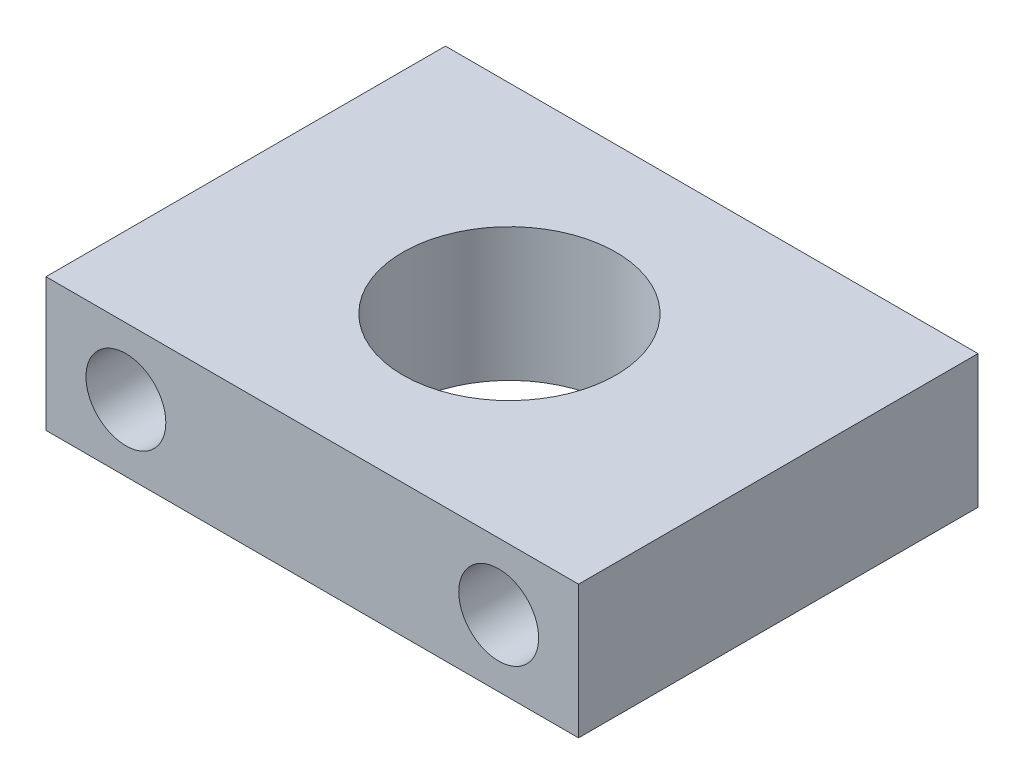
ISO-10303-21;
HEADER;
FILE_DESCRIPTION(('STEP AP214'),'2;1');
FILE_NAME('part.step','',(''),(''),'','','');
FILE_SCHEMA(('AUTOMOTIVE_DESIGN { 1 0 10303 214 1 1 1 1 }'));
ENDSEC;
DATA;
#1=APPLICATION_CONTEXT('core data for automotive mechanical design processes');
#2=APPLICATION_PROTOCOL_DEFINITION('international standard','automotive_design',2000,#1);
#3=PRODUCT_CONTEXT('',#1,'mechanical');
#4=PRODUCT('Part','Part','',(#3));
#5=PRODUCT_RELATED_PRODUCT_CATEGORY('part','',(#4));
#6=PRODUCT_DEFINITION_FORMATION('','',#4);
#7=PRODUCT_DEFINITION_CONTEXT('part definition',#1,'design');
#8=PRODUCT_DEFINITION('design','',#6,#7);
#9=PRODUCT_DEFINITION_SHAPE('','',#8);
#10=(LENGTH_UNIT() NAMED_UNIT(*) SI_UNIT(.MILLI.,.METRE.));
#11=(NAMED_UNIT(*) PLANE_ANGLE_UNIT() SI_UNIT($,.RADIAN.));
#12=(NAMED_UNIT(*) SI_UNIT($,.STERADIAN.) SOLID_ANGLE_UNIT());
#13=UNCERTAINTY_MEASURE_WITH_UNIT(LENGTH_MEASURE(1.E-05),#10,'distance_accuracy_value','');
#14=(GEOMETRIC_REPRESENTATION_CONTEXT(3) GLOBAL_UNCERTAINTY_ASSIGNED_CONTEXT((#13)) GLOBAL_UNIT_ASSIGNED_CONTEXT((#10,
#11,#12)) REPRESENTATION_CONTEXT('',''));
#15=CARTESIAN_POINT('',(0.,0.,0.));
#16=DIRECTION('',(0.,0.,1.));
#17=DIRECTION('',(1.,0.,0.));
#18=AXIS2_PLACEMENT_3D('',#15,#16,#17);
#19=CARTESIAN_POINT('',(-16.9830898985862,5.,-2.67725088495042));
#20=DIRECTION('',(1.,0.,0.));
#21=DIRECTION('',(0.,0.,-1.));
#22=AXIS2_PLACEMENT_3D('',#19,#20,#21);
#23=PLANE('',#22);
#24=DIRECTION('',(0.,0.,1.));
#25=VECTOR('',#24,1.);
#26=CARTESIAN_POINT('',(-16.9830898985862,0.,-2.67725088495042));
#27=LINE('',#26,#25);
#28=CARTESIAN_POINT('',(-16.9830898985862,0.,-2.67725088495042));
#29=VERTEX_POINT('',#28);
#30=CARTESIAN_POINT('',(-16.9830898985862,0.,12.3227491150496));
#31=VERTEX_POINT('',#30);
#32=EDGE_CURVE('E97',#29,#31,#27,.T.);
#33=ORIENTED_EDGE('',*,*,#32,.T.);
#34=DIRECTION('',(0.,-1.,0.));
#35=VECTOR('',#34,1.);
#36=CARTESIAN_POINT('',(-16.9830898985862,5.,12.3227491150496));
#37=LINE('',#36,#35);
#38=CARTESIAN_POINT('',(-16.9830898985862,5.,12.3227491150496));
#39=VERTEX_POINT('',#38);
#40=EDGE_CURVE('E11',#39,#31,#37,.T.);
#41=ORIENTED_EDGE('',*,*,#40,.F.);
#42=DIRECTION('',(0.,0.,1.));
#43=VECTOR('',#42,1.);
#44=CARTESIAN_POINT('',(-16.9830898985862,5.,-2.67725088495042));
#45=LINE('',#44,#43);
#46=CARTESIAN_POINT('',(-16.9830898985862,5.,-2.67725088495042));
#47=VERTEX_POINT('',#46);
#48=EDGE_CURVE('E85',#47,#39,#45,.T.);
#49=ORIENTED_EDGE('',*,*,#48,.F.);
#50=DIRECTION('',(0.,-1.,0.));
#51=VECTOR('',#50,1.);
#52=CARTESIAN_POINT('',(-16.9830898985862,5.,-2.67725088495042));
#53=LINE('',#52,#51);
#54=EDGE_CURVE('E93',#47,#29,#53,.T.);
#55=ORIENTED_EDGE('',*,*,#54,.T.);
#56=EDGE_LOOP('',(#33,#41,#49,#55));
#57=FACE_BOUND('',#56,.T.);
#58=ADVANCED_FACE('F34',(#57),#23,.F.);
#59=CARTESIAN_POINT('',(-16.9830898985862,5.,12.3227491150496));
#60=DIRECTION('',(0.,0.,-1.));
#61=DIRECTION('',(-1.,0.,0.));
#62=AXIS2_PLACEMENT_3D('',#59,#60,#61);
#63=PLANE('',#62);
#64=CARTESIAN_POINT('',(-13.9830898985862,2.5,12.3227491150496));
#65=DIRECTION('',(0.,0.,1.));
#66=DIRECTION('',(1.,0.,0.));
#67=AXIS2_PLACEMENT_3D('',#64,#65,#66);
#68=CIRCLE('',#67,1.5);
#69=CARTESIAN_POINT('',(-12.4830898985862,2.5,12.3227491150496));
#70=VERTEX_POINT('',#69);
#71=EDGE_CURVE('E118',#70,#70,#68,.T.);
#72=ORIENTED_EDGE('',*,*,#71,.F.);
#73=EDGE_LOOP('',(#72));
#74=FACE_BOUND('',#73,.T.);
#75=CARTESIAN_POINT('',(0.0169101014137855,2.5,12.3227491150496));
#76=DIRECTION('',(0.,0.,1.));
#77=DIRECTION('',(-1.,0.,0.));
#78=AXIS2_PLACEMENT_3D('',#75,#76,#77);
#79=CIRCLE('',#78,1.5);
#80=CARTESIAN_POINT('',(-1.48308989858622,2.5,12.3227491150496));
#81=VERTEX_POINT('',#80);
#82=EDGE_CURVE('E111',#81,#81,#79,.T.);
#83=ORIENTED_EDGE('',*,*,#82,.F.);
#84=EDGE_LOOP('',(#83));
#85=FACE_BOUND('',#84,.T.);
#86=DIRECTION('',(1.,0.,0.));
#87=VECTOR('',#86,1.);
#88=CARTESIAN_POINT('',(-16.9830898985862,0.,12.3227491150496));
#89=LINE('',#88,#87);
#90=CARTESIAN_POINT('',(3.01691010141378,0.,12.3227491150496));
#91=VERTEX_POINT('',#90);
#92=EDGE_CURVE('E89',#31,#91,#89,.T.);
#93=ORIENTED_EDGE('',*,*,#92,.T.);
#94=DIRECTION('',(0.,-1.,0.));
#95=VECTOR('',#94,1.);
#96=CARTESIAN_POINT('',(3.01691010141378,5.,12.3227491150496));
#97=LINE('',#96,#95);
#98=CARTESIAN_POINT('',(3.01691010141378,5.,12.3227491150496));
#99=VERTEX_POINT('',#98);
#100=EDGE_CURVE('E42',#99,#91,#97,.T.);
#101=ORIENTED_EDGE('',*,*,#100,.F.);
#102=DIRECTION('',(1.,0.,0.));
#103=VECTOR('',#102,1.);
#104=CARTESIAN_POINT('',(-16.9830898985862,5.,12.3227491150496));
#105=LINE('',#104,#103);
#106=EDGE_CURVE('E80',#39,#99,#105,.T.);
#107=ORIENTED_EDGE('',*,*,#106,.F.);
#108=ORIENTED_EDGE('',*,*,#40,.T.);
#109=EDGE_LOOP('',(#93,#101,#107,#108));
#110=FACE_BOUND('',#109,.T.);
#111=ADVANCED_FACE('F88',(#74,#85,#110),#63,.F.);
#112=CARTESIAN_POINT('',(3.01691010141378,5.,-2.67725088495042));
#113=DIRECTION('',(-1.,0.,0.));
#114=DIRECTION('',(0.,0.,1.));
#115=AXIS2_PLACEMENT_3D('',#112,#113,#114);
#116=PLANE('',#115);
#117=DIRECTION('',(0.,0.,-1.));
#118=VECTOR('',#117,1.);
#119=CARTESIAN_POINT('',(3.01691010141378,0.,-2.67725088495042));
#120=LINE('',#119,#118);
#121=CARTESIAN_POINT('',(3.01691010141378,0.,-2.67725088495042));
#122=VERTEX_POINT('',#121);
#123=EDGE_CURVE('E67',#91,#122,#120,.T.);
#124=ORIENTED_EDGE('',*,*,#123,.T.);
#125=DIRECTION('',(0.,-1.,0.));
#126=VECTOR('',#125,1.);
#127=CARTESIAN_POINT('',(3.01691010141378,5.,-2.67725088495042));
#128=LINE('',#127,#126);
#129=CARTESIAN_POINT('',(3.01691010141378,5.,-2.67725088495042));
#130=VERTEX_POINT('',#129);
#131=EDGE_CURVE('E90',#130,#122,#128,.T.);
#132=ORIENTED_EDGE('',*,*,#131,.F.);
#133=DIRECTION('',(0.,0.,-1.));
#134=VECTOR('',#133,1.);
#135=CARTESIAN_POINT('',(3.01691010141378,5.,-2.67725088495042));
#136=LINE('',#135,#134);
#137=EDGE_CURVE('E83',#99,#130,#136,.T.);
#138=ORIENTED_EDGE('',*,*,#137,.F.);
#139=ORIENTED_EDGE('',*,*,#100,.T.);
#140=EDGE_LOOP('',(#124,#132,#138,#139));
#141=FACE_BOUND('',#140,.T.);
#142=ADVANCED_FACE('F91',(#141),#116,.F.);
#143=CARTESIAN_POINT('',(-16.9830898985862,5.,-2.67725088495042));
#144=DIRECTION('',(0.,0.,1.));
#145=DIRECTION('',(1.,0.,0.));
#146=AXIS2_PLACEMENT_3D('',#143,#144,#145);
#147=PLANE('',#146);
#148=CARTESIAN_POINT('',(-13.9830898985862,2.5,-2.67725088495042));
#149=DIRECTION('',(0.,0.,1.));
#150=DIRECTION('',(1.,0.,0.));
#151=AXIS2_PLACEMENT_3D('',#148,#149,#150);
#152=CIRCLE('',#151,1.5);
#153=CARTESIAN_POINT('',(-12.4830898985862,2.5,-2.67725088495042));
#154=VERTEX_POINT('',#153);
#155=EDGE_CURVE('E100',#154,#154,#152,.T.);
#156=ORIENTED_EDGE('',*,*,#155,.T.);
#157=EDGE_LOOP('',(#156));
#158=FACE_BOUND('',#157,.T.);
#159=CARTESIAN_POINT('',(0.0169101014137855,2.5,-2.67725088495042));
#160=DIRECTION('',(0.,0.,1.));
#161=DIRECTION('',(-1.,0.,0.));
#162=AXIS2_PLACEMENT_3D('',#159,#160,#161);
#163=CIRCLE('',#162,1.5);
#164=CARTESIAN_POINT('',(-1.48308989858622,2.5,-2.67725088495042));
#165=VERTEX_POINT('',#164);
#166=EDGE_CURVE('E114',#165,#165,#163,.T.);
#167=ORIENTED_EDGE('',*,*,#166,.T.);
#168=EDGE_LOOP('',(#167));
#169=FACE_BOUND('',#168,.T.);
#170=DIRECTION('',(-1.,0.,0.));
#171=VECTOR('',#170,1.);
#172=CARTESIAN_POINT('',(-16.9830898985862,0.,-2.67725088495042));
#173=LINE('',#172,#171);
#174=EDGE_CURVE('E73',#122,#29,#173,.T.);
#175=ORIENTED_EDGE('',*,*,#174,.T.);
#176=ORIENTED_EDGE('',*,*,#54,.F.);
#177=DIRECTION('',(-1.,0.,0.));
#178=VECTOR('',#177,1.);
#179=CARTESIAN_POINT('',(-16.9830898985862,5.,-2.67725088495042));
#180=LINE('',#179,#178);
#181=EDGE_CURVE('E50',#130,#47,#180,.T.);
#182=ORIENTED_EDGE('',*,*,#181,.F.);
#183=ORIENTED_EDGE('',*,*,#131,.T.);
#184=EDGE_LOOP('',(#175,#176,#182,#183));
#185=FACE_BOUND('',#184,.T.);
#186=ADVANCED_FACE('F105',(#158,#169,#185),#147,.F.);
#187=CARTESIAN_POINT('',(0.,5.,0.));
#188=DIRECTION('',(0.,1.,0.));
#189=DIRECTION('',(0.,0.,1.));
#190=AXIS2_PLACEMENT_3D('',#187,#188,#189);
#191=PLANE('',#190);
#192=CARTESIAN_POINT('',(-7.08032107420209,5.,4.82274911504958));
#193=DIRECTION('',(0.,1.,0.));
#194=DIRECTION('',(0.,0.,1.));
#195=AXIS2_PLACEMENT_3D('',#192,#193,#194);
#196=CIRCLE('',#195,4.);
#197=CARTESIAN_POINT('',(-7.08032107420209,5.,8.82274911504958));
#198=VERTEX_POINT('',#197);
#199=EDGE_CURVE('E123',#198,#198,#196,.T.);
#200=ORIENTED_EDGE('',*,*,#199,.F.);
#201=EDGE_LOOP('',(#200));
#202=FACE_BOUND('',#201,.T.);
#203=ORIENTED_EDGE('',*,*,#48,.T.);
#204=ORIENTED_EDGE('',*,*,#106,.T.);
#205=ORIENTED_EDGE('',*,*,#137,.T.);
#206=ORIENTED_EDGE('',*,*,#181,.T.);
#207=EDGE_LOOP('',(#203,#204,#205,#206));
#208=FACE_BOUND('',#207,.T.);
#209=ADVANCED_FACE('F81',(#202,#208),#191,.T.);
#210=CARTESIAN_POINT('',(0.,0.,0.));
#211=DIRECTION('',(0.,1.,0.));
#212=DIRECTION('',(0.,0.,1.));
#213=AXIS2_PLACEMENT_3D('',#210,#211,#212);
#214=PLANE('',#213);
#215=CARTESIAN_POINT('',(-7.08032107420209,0.,4.82274911504958));
#216=DIRECTION('',(0.,1.,0.));
#217=DIRECTION('',(0.,0.,1.));
#218=AXIS2_PLACEMENT_3D('',#215,#216,#217);
#219=CIRCLE('',#218,4.);
#220=CARTESIAN_POINT('',(-7.08032107420209,0.,8.82274911504958));
#221=VERTEX_POINT('',#220);
#222=EDGE_CURVE('E115',#221,#221,#219,.T.);
#223=ORIENTED_EDGE('',*,*,#222,.T.);
#224=EDGE_LOOP('',(#223));
#225=FACE_BOUND('',#224,.T.);
#226=ORIENTED_EDGE('',*,*,#32,.F.);
#227=ORIENTED_EDGE('',*,*,#174,.F.);
#228=ORIENTED_EDGE('',*,*,#123,.F.);
#229=ORIENTED_EDGE('',*,*,#92,.F.);
#230=EDGE_LOOP('',(#226,#227,#228,#229));
#231=FACE_BOUND('',#230,.T.);
#232=ADVANCED_FACE('F108',(#225,#231),#214,.F.);
#233=CARTESIAN_POINT('',(0.0169101014137855,2.5,-2.67725088495042));
#234=DIRECTION('',(0.,0.,1.));
#235=DIRECTION('',(1.,0.,0.));
#236=AXIS2_PLACEMENT_3D('',#233,#234,#235);
#237=CYLINDRICAL_SURFACE('',#236,1.5);
#238=ORIENTED_EDGE('',*,*,#166,.F.);
#239=EDGE_LOOP('',(#238));
#240=FACE_BOUND('',#239,.T.);
#241=ORIENTED_EDGE('',*,*,#82,.T.);
#242=EDGE_LOOP('',(#241));
#243=FACE_BOUND('',#242,.T.);
#244=ADVANCED_FACE('F143',(#240,#243),#237,.F.);
#245=CARTESIAN_POINT('',(-13.9830898985862,2.5,-2.67725088495042));
#246=DIRECTION('',(0.,0.,1.));
#247=DIRECTION('',(1.,0.,0.));
#248=AXIS2_PLACEMENT_3D('',#245,#246,#247);
#249=CYLINDRICAL_SURFACE('',#248,1.5);
#250=ORIENTED_EDGE('',*,*,#155,.F.);
#251=EDGE_LOOP('',(#250));
#252=FACE_BOUND('',#251,.T.);
#253=ORIENTED_EDGE('',*,*,#71,.T.);
#254=EDGE_LOOP('',(#253));
#255=FACE_BOUND('',#254,.T.);
#256=ADVANCED_FACE('F133',(#252,#255),#249,.F.);
#257=CARTESIAN_POINT('',(-7.08032107420209,0.,4.82274911504958));
#258=DIRECTION('',(0.,1.,0.));
#259=DIRECTION('',(0.,0.,1.));
#260=AXIS2_PLACEMENT_3D('',#257,#258,#259);
#261=CYLINDRICAL_SURFACE('',#260,4.);
#262=ORIENTED_EDGE('',*,*,#222,.F.);
#263=EDGE_LOOP('',(#262));
#264=FACE_BOUND('',#263,.T.);
#265=ORIENTED_EDGE('',*,*,#199,.T.);
#266=EDGE_LOOP('',(#265));
#267=FACE_BOUND('',#266,.T.);
#268=ADVANCED_FACE('F130',(#264,#267),#261,.F.);
#269=CLOSED_SHELL('',(#58,#111,#142,#186,#209,#232,#244,#256,#268));
#270=MANIFOLD_SOLID_BREP('B2',#269);
#271=ADVANCED_BREP_SHAPE_REPRESENTATION('',(#18,#270),#14);
#272=SHAPE_DEFINITION_REPRESENTATION(#9,#271);
ENDSEC;
END-ISO-10303-21;
